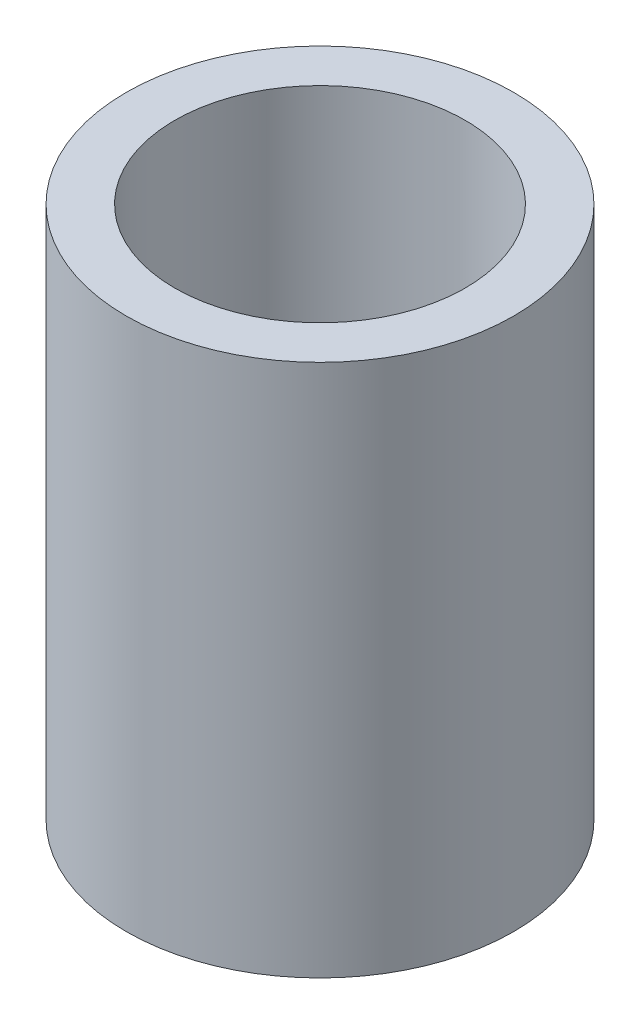
ISO-10303-21;
HEADER;
FILE_DESCRIPTION(('STEP AP214'),'2;1');
FILE_NAME('part.step','',(''),(''),'','','');
FILE_SCHEMA(('AUTOMOTIVE_DESIGN { 1 0 10303 214 1 1 1 1 }'));
ENDSEC;
DATA;
#1=APPLICATION_CONTEXT('core data for automotive mechanical design processes');
#2=APPLICATION_PROTOCOL_DEFINITION('international standard','automotive_design',2000,#1);
#3=PRODUCT_CONTEXT('',#1,'mechanical');
#4=PRODUCT('Part','Part','',(#3));
#5=PRODUCT_RELATED_PRODUCT_CATEGORY('part','',(#4));
#6=PRODUCT_DEFINITION_FORMATION('','',#4);
#7=PRODUCT_DEFINITION_CONTEXT('part definition',#1,'design');
#8=PRODUCT_DEFINITION('design','',#6,#7);
#9=PRODUCT_DEFINITION_SHAPE('','',#8);
#10=(LENGTH_UNIT() NAMED_UNIT(*) SI_UNIT(.MILLI.,.METRE.));
#11=(NAMED_UNIT(*) PLANE_ANGLE_UNIT() SI_UNIT($,.RADIAN.));
#12=(NAMED_UNIT(*) SI_UNIT($,.STERADIAN.) SOLID_ANGLE_UNIT());
#13=UNCERTAINTY_MEASURE_WITH_UNIT(LENGTH_MEASURE(1.E-05),#10,'distance_accuracy_value','');
#14=(GEOMETRIC_REPRESENTATION_CONTEXT(3) GLOBAL_UNCERTAINTY_ASSIGNED_CONTEXT((#13)) GLOBAL_UNIT_ASSIGNED_CONTEXT((#10,
#11,#12)) REPRESENTATION_CONTEXT('',''));
#15=CARTESIAN_POINT('',(0.,0.,0.));
#16=DIRECTION('',(0.,0.,1.));
#17=DIRECTION('',(1.,0.,0.));
#18=AXIS2_PLACEMENT_3D('',#15,#16,#17);
#19=CARTESIAN_POINT('',(0.,17.4752,0.));
#20=DIRECTION('',(0.,-1.,0.));
#21=DIRECTION('',(0.,0.,-1.));
#22=AXIS2_PLACEMENT_3D('',#19,#20,#21);
#23=CYLINDRICAL_SURFACE('',#22,4.7625);
#24=CARTESIAN_POINT('',(0.,17.4752,0.));
#25=DIRECTION('',(0.,1.,0.));
#26=DIRECTION('',(0.,0.,1.));
#27=AXIS2_PLACEMENT_3D('',#24,#25,#26);
#28=CIRCLE('',#27,4.7625);
#29=CARTESIAN_POINT('',(0.,17.4752,4.7625));
#30=VERTEX_POINT('',#29);
#31=EDGE_CURVE('E49',#30,#30,#28,.T.);
#32=ORIENTED_EDGE('',*,*,#31,.T.);
#33=EDGE_LOOP('',(#32));
#34=FACE_BOUND('',#33,.T.);
#35=CARTESIAN_POINT('',(0.,0.,0.));
#36=DIRECTION('',(0.,1.,0.));
#37=DIRECTION('',(0.,0.,1.));
#38=AXIS2_PLACEMENT_3D('',#35,#36,#37);
#39=CIRCLE('',#38,4.7625);
#40=CARTESIAN_POINT('',(0.,0.,4.7625));
#41=VERTEX_POINT('',#40);
#42=EDGE_CURVE('E11',#41,#41,#39,.T.);
#43=ORIENTED_EDGE('',*,*,#42,.F.);
#44=EDGE_LOOP('',(#43));
#45=FACE_BOUND('',#44,.T.);
#46=ADVANCED_FACE('F16',(#34,#45),#23,.F.);
#47=CARTESIAN_POINT('',(0.,17.4752,0.));
#48=DIRECTION('',(0.,-1.,0.));
#49=DIRECTION('',(0.,0.,-1.));
#50=AXIS2_PLACEMENT_3D('',#47,#48,#49);
#51=CYLINDRICAL_SURFACE('',#50,6.35);
#52=CARTESIAN_POINT('',(0.,17.4752,0.));
#53=DIRECTION('',(0.,1.,0.));
#54=DIRECTION('',(0.,0.,1.));
#55=AXIS2_PLACEMENT_3D('',#52,#53,#54);
#56=CIRCLE('',#55,6.35);
#57=CARTESIAN_POINT('',(0.,17.4752,6.35));
#58=VERTEX_POINT('',#57);
#59=EDGE_CURVE('E20',#58,#58,#56,.T.);
#60=ORIENTED_EDGE('',*,*,#59,.F.);
#61=EDGE_LOOP('',(#60));
#62=FACE_BOUND('',#61,.T.);
#63=CARTESIAN_POINT('',(0.,0.,0.));
#64=DIRECTION('',(0.,1.,0.));
#65=DIRECTION('',(0.,0.,1.));
#66=AXIS2_PLACEMENT_3D('',#63,#64,#65);
#67=CIRCLE('',#66,6.35);
#68=CARTESIAN_POINT('',(0.,0.,6.35));
#69=VERTEX_POINT('',#68);
#70=EDGE_CURVE('E27',#69,#69,#67,.T.);
#71=ORIENTED_EDGE('',*,*,#70,.T.);
#72=EDGE_LOOP('',(#71));
#73=FACE_BOUND('',#72,.T.);
#74=ADVANCED_FACE('F71',(#62,#73),#51,.T.);
#75=CARTESIAN_POINT('',(0.,0.,0.));
#76=DIRECTION('',(0.,1.,0.));
#77=DIRECTION('',(1.,0.,0.));
#78=AXIS2_PLACEMENT_3D('',#75,#76,#77);
#79=PLANE('',#78);
#80=ORIENTED_EDGE('',*,*,#42,.T.);
#81=EDGE_LOOP('',(#80));
#82=FACE_BOUND('',#81,.T.);
#83=ORIENTED_EDGE('',*,*,#70,.F.);
#84=EDGE_LOOP('',(#83));
#85=FACE_BOUND('',#84,.T.);
#86=ADVANCED_FACE('F18',(#82,#85),#79,.F.);
#87=CARTESIAN_POINT('',(0.,17.4752,0.));
#88=DIRECTION('',(0.,1.,0.));
#89=DIRECTION('',(1.,0.,0.));
#90=AXIS2_PLACEMENT_3D('',#87,#88,#89);
#91=PLANE('',#90);
#92=ORIENTED_EDGE('',*,*,#31,.F.);
#93=EDGE_LOOP('',(#92));
#94=FACE_BOUND('',#93,.T.);
#95=ORIENTED_EDGE('',*,*,#59,.T.);
#96=EDGE_LOOP('',(#95));
#97=FACE_BOUND('',#96,.T.);
#98=ADVANCED_FACE('F56',(#94,#97),#91,.T.);
#99=CLOSED_SHELL('',(#46,#74,#86,#98));
#100=MANIFOLD_SOLID_BREP('B1',#99);
#101=ADVANCED_BREP_SHAPE_REPRESENTATION('',(#18,#100),#14);
#102=SHAPE_DEFINITION_REPRESENTATION(#9,#101);
ENDSEC;
END-ISO-10303-21;
